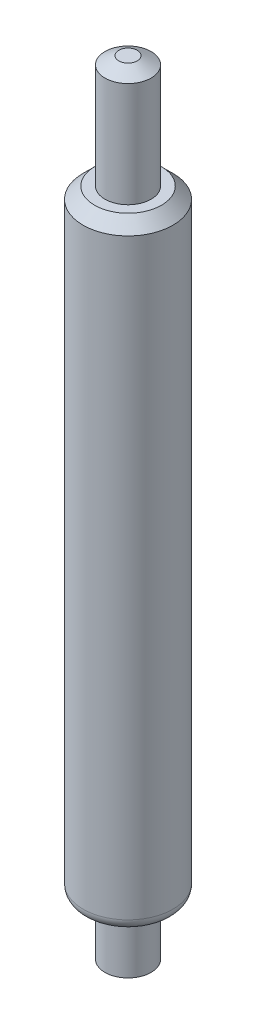
ISO-10303-21;
HEADER;
FILE_DESCRIPTION(('STEP AP214'),'2;1');
FILE_NAME('part.step','',(''),(''),'','','');
FILE_SCHEMA(('AUTOMOTIVE_DESIGN { 1 0 10303 214 1 1 1 1 }'));
ENDSEC;
DATA;
#1=APPLICATION_CONTEXT('core data for automotive mechanical design processes');
#2=APPLICATION_PROTOCOL_DEFINITION('international standard','automotive_design',2000,#1);
#3=PRODUCT_CONTEXT('',#1,'mechanical');
#4=PRODUCT('Part','Part','',(#3));
#5=PRODUCT_RELATED_PRODUCT_CATEGORY('part','',(#4));
#6=PRODUCT_DEFINITION_FORMATION('','',#4);
#7=PRODUCT_DEFINITION_CONTEXT('part definition',#1,'design');
#8=PRODUCT_DEFINITION('design','',#6,#7);
#9=PRODUCT_DEFINITION_SHAPE('','',#8);
#10=(LENGTH_UNIT() NAMED_UNIT(*) SI_UNIT(.MILLI.,.METRE.));
#11=(NAMED_UNIT(*) PLANE_ANGLE_UNIT() SI_UNIT($,.RADIAN.));
#12=(NAMED_UNIT(*) SI_UNIT($,.STERADIAN.) SOLID_ANGLE_UNIT());
#13=UNCERTAINTY_MEASURE_WITH_UNIT(LENGTH_MEASURE(1.E-05),#10,'distance_accuracy_value','');
#14=(GEOMETRIC_REPRESENTATION_CONTEXT(3) GLOBAL_UNCERTAINTY_ASSIGNED_CONTEXT((#13)) GLOBAL_UNIT_ASSIGNED_CONTEXT((#10,
#11,#12)) REPRESENTATION_CONTEXT('',''));
#15=CARTESIAN_POINT('',(0.,0.,0.));
#16=DIRECTION('',(0.,0.,1.));
#17=DIRECTION('',(1.,0.,0.));
#18=AXIS2_PLACEMENT_3D('',#15,#16,#17);
#19=CARTESIAN_POINT('',(0.,1.715,0.));
#20=DIRECTION('',(0.,1.,0.));
#21=DIRECTION('',(0.,0.,1.));
#22=AXIS2_PLACEMENT_3D('',#19,#20,#21);
#23=PLANE('',#22);
#24=CARTESIAN_POINT('',(0.,1.715,0.));
#25=DIRECTION('',(0.,1.,0.));
#26=DIRECTION('',(0.,0.,1.));
#27=AXIS2_PLACEMENT_3D('',#24,#25,#26);
#28=CIRCLE('',#27,0.0400000000000001);
#29=CARTESIAN_POINT('',(0.,1.715,0.0400000000000001));
#30=VERTEX_POINT('',#29);
#31=EDGE_CURVE('E75',#30,#30,#28,.T.);
#32=ORIENTED_EDGE('',*,*,#31,.T.);
#33=EDGE_LOOP('',(#32));
#34=FACE_BOUND('',#33,.T.);
#35=ADVANCED_FACE('F43',(#34),#23,.T.);
#36=CARTESIAN_POINT('',(0.,-1.05749908162705,0.));
#37=DIRECTION('',(0.,-1.,0.));
#38=DIRECTION('',(0.,0.,-1.));
#39=AXIS2_PLACEMENT_3D('',#36,#37,#38);
#40=CYLINDRICAL_SURFACE('',#39,0.1);
#41=CARTESIAN_POINT('',(0.,1.68035898384862,0.));
#42=DIRECTION('',(0.,1.,0.));
#43=DIRECTION('',(0.,0.,1.));
#44=AXIS2_PLACEMENT_3D('',#41,#42,#43);
#45=CIRCLE('',#44,0.1);
#46=CARTESIAN_POINT('',(0.,1.68035898384862,0.1));
#47=VERTEX_POINT('',#46);
#48=EDGE_CURVE('E79',#47,#47,#45,.F.);
#49=ORIENTED_EDGE('',*,*,#48,.T.);
#50=EDGE_LOOP('',(#49));
#51=FACE_BOUND('',#50,.T.);
#52=CARTESIAN_POINT('',(0.,1.225,0.));
#53=DIRECTION('',(0.,-1.,0.));
#54=DIRECTION('',(0.,0.,-1.));
#55=AXIS2_PLACEMENT_3D('',#52,#53,#54);
#56=CIRCLE('',#55,0.1);
#57=CARTESIAN_POINT('',(0.,1.225,-0.1));
#58=VERTEX_POINT('',#57);
#59=EDGE_CURVE('E83',#58,#58,#56,.T.);
#60=ORIENTED_EDGE('',*,*,#59,.F.);
#61=EDGE_LOOP('',(#60));
#62=FACE_BOUND('',#61,.T.);
#63=ADVANCED_FACE('F108',(#51,#62),#40,.T.);
#64=CARTESIAN_POINT('',(0.1,1.225,0.));
#65=DIRECTION('',(0.,1.,0.));
#66=DIRECTION('',(0.,0.,1.));
#67=AXIS2_PLACEMENT_3D('',#64,#65,#66);
#68=PLANE('',#67);
#69=CARTESIAN_POINT('',(0.,1.225,0.));
#70=DIRECTION('',(0.,1.,0.));
#71=DIRECTION('',(0.,0.,1.));
#72=AXIS2_PLACEMENT_3D('',#69,#70,#71);
#73=CIRCLE('',#72,0.145000000000001);
#74=CARTESIAN_POINT('',(0.,1.225,0.145000000000001));
#75=VERTEX_POINT('',#74);
#76=EDGE_CURVE('E56',#75,#75,#73,.T.);
#77=ORIENTED_EDGE('',*,*,#76,.T.);
#78=EDGE_LOOP('',(#77));
#79=FACE_BOUND('',#78,.T.);
#80=ORIENTED_EDGE('',*,*,#59,.T.);
#81=EDGE_LOOP('',(#80));
#82=FACE_BOUND('',#81,.T.);
#83=ADVANCED_FACE('F105',(#79,#82),#68,.T.);
#84=CARTESIAN_POINT('',(0.,-1.05749908162705,0.));
#85=DIRECTION('',(0.,-1.,0.));
#86=DIRECTION('',(0.,0.,-1.));
#87=AXIS2_PLACEMENT_3D('',#84,#85,#86);
#88=CYLINDRICAL_SURFACE('',#87,0.195);
#89=CARTESIAN_POINT('',(0.,-1.395,0.));
#90=DIRECTION('',(0.,-1.,0.));
#91=DIRECTION('',(0.,0.,-1.));
#92=AXIS2_PLACEMENT_3D('',#89,#90,#91);
#93=CIRCLE('',#92,0.195);
#94=CARTESIAN_POINT('',(0.,-1.395,-0.195));
#95=VERTEX_POINT('',#94);
#96=EDGE_CURVE('E10',#95,#95,#93,.F.);
#97=ORIENTED_EDGE('',*,*,#96,.T.);
#98=EDGE_LOOP('',(#97));
#99=FACE_BOUND('',#98,.T.);
#100=CARTESIAN_POINT('',(0.,1.175,0.));
#101=DIRECTION('',(0.,1.,0.));
#102=DIRECTION('',(0.,0.,1.));
#103=AXIS2_PLACEMENT_3D('',#100,#101,#102);
#104=CIRCLE('',#103,0.195);
#105=CARTESIAN_POINT('',(0.,1.175,0.195));
#106=VERTEX_POINT('',#105);
#107=EDGE_CURVE('E61',#106,#106,#104,.F.);
#108=ORIENTED_EDGE('',*,*,#107,.T.);
#109=EDGE_LOOP('',(#108));
#110=FACE_BOUND('',#109,.T.);
#111=ADVANCED_FACE('F96',(#99,#110),#88,.T.);
#112=CARTESIAN_POINT('',(0.195,-1.445,0.));
#113=DIRECTION('',(0.,-1.,0.));
#114=DIRECTION('',(0.,0.,-1.));
#115=AXIS2_PLACEMENT_3D('',#112,#113,#114);
#116=PLANE('',#115);
#117=CARTESIAN_POINT('',(0.,-1.445,0.));
#118=DIRECTION('',(0.,-1.,0.));
#119=DIRECTION('',(0.,0.,-1.));
#120=AXIS2_PLACEMENT_3D('',#117,#118,#119);
#121=CIRCLE('',#120,0.145);
#122=CARTESIAN_POINT('',(0.,-1.445,-0.145));
#123=VERTEX_POINT('',#122);
#124=EDGE_CURVE('E51',#123,#123,#121,.T.);
#125=ORIENTED_EDGE('',*,*,#124,.T.);
#126=EDGE_LOOP('',(#125));
#127=FACE_BOUND('',#126,.T.);
#128=CARTESIAN_POINT('',(0.,-1.445,0.));
#129=DIRECTION('',(0.,-1.,0.));
#130=DIRECTION('',(0.,0.,-1.));
#131=AXIS2_PLACEMENT_3D('',#128,#129,#130);
#132=CIRCLE('',#131,0.1);
#133=CARTESIAN_POINT('',(0.,-1.445,-0.1));
#134=VERTEX_POINT('',#133);
#135=EDGE_CURVE('E87',#134,#134,#132,.T.);
#136=ORIENTED_EDGE('',*,*,#135,.F.);
#137=EDGE_LOOP('',(#136));
#138=FACE_BOUND('',#137,.T.);
#139=ADVANCED_FACE('F94',(#127,#138),#116,.T.);
#140=CARTESIAN_POINT('',(0.,-1.05749908162705,0.));
#141=DIRECTION('',(0.,-1.,0.));
#142=DIRECTION('',(0.,0.,-1.));
#143=AXIS2_PLACEMENT_3D('',#140,#141,#142);
#144=CYLINDRICAL_SURFACE('',#143,0.1);
#145=CARTESIAN_POINT('',(0.,-1.68035898384862,0.));
#146=DIRECTION('',(0.,-1.,0.));
#147=DIRECTION('',(0.,0.,-1.));
#148=AXIS2_PLACEMENT_3D('',#145,#146,#147);
#149=CIRCLE('',#148,0.1);
#150=CARTESIAN_POINT('',(0.,-1.68035898384862,-0.1));
#151=VERTEX_POINT('',#150);
#152=EDGE_CURVE('E67',#151,#151,#149,.F.);
#153=ORIENTED_EDGE('',*,*,#152,.T.);
#154=EDGE_LOOP('',(#153));
#155=FACE_BOUND('',#154,.T.);
#156=ORIENTED_EDGE('',*,*,#135,.T.);
#157=EDGE_LOOP('',(#156));
#158=FACE_BOUND('',#157,.T.);
#159=ADVANCED_FACE('F92',(#155,#158),#144,.T.);
#160=CARTESIAN_POINT('',(0.1,-1.715,0.));
#161=DIRECTION('',(0.,-1.,0.));
#162=DIRECTION('',(0.,0.,-1.));
#163=AXIS2_PLACEMENT_3D('',#160,#161,#162);
#164=PLANE('',#163);
#165=CARTESIAN_POINT('',(0.,-1.715,0.));
#166=DIRECTION('',(0.,-1.,0.));
#167=DIRECTION('',(0.,0.,-1.));
#168=AXIS2_PLACEMENT_3D('',#165,#166,#167);
#169=CIRCLE('',#168,0.0400000000000005);
#170=CARTESIAN_POINT('',(0.,-1.715,-0.0400000000000005));
#171=VERTEX_POINT('',#170);
#172=EDGE_CURVE('E71',#171,#171,#169,.T.);
#173=ORIENTED_EDGE('',*,*,#172,.T.);
#174=EDGE_LOOP('',(#173));
#175=FACE_BOUND('',#174,.T.);
#176=ADVANCED_FACE('F102',(#175),#164,.T.);
#177=CARTESIAN_POINT('',(0.,1.68035898384862,0.));
#178=DIRECTION('',(0.,-1.,0.));
#179=DIRECTION('',(0.,0.,-1.));
#180=AXIS2_PLACEMENT_3D('',#177,#178,#179);
#181=CONICAL_SURFACE('',#180,0.1,1.0471975511966);
#182=ORIENTED_EDGE('',*,*,#31,.F.);
#183=EDGE_LOOP('',(#182));
#184=FACE_BOUND('',#183,.T.);
#185=ORIENTED_EDGE('',*,*,#48,.F.);
#186=EDGE_LOOP('',(#185));
#187=FACE_BOUND('',#186,.T.);
#188=ADVANCED_FACE('F119',(#184,#187),#181,.T.);
#189=CARTESIAN_POINT('',(0.,-1.715,0.));
#190=DIRECTION('',(0.,1.,0.));
#191=DIRECTION('',(0.,0.,1.));
#192=AXIS2_PLACEMENT_3D('',#189,#190,#191);
#193=CONICAL_SURFACE('',#192,0.0400000000000005,1.0471975511966);
#194=ORIENTED_EDGE('',*,*,#152,.F.);
#195=EDGE_LOOP('',(#194));
#196=FACE_BOUND('',#195,.T.);
#197=ORIENTED_EDGE('',*,*,#172,.F.);
#198=EDGE_LOOP('',(#197));
#199=FACE_BOUND('',#198,.T.);
#200=ADVANCED_FACE('F125',(#196,#199),#193,.T.);
#201=CARTESIAN_POINT('',(0.,1.175,0.));
#202=DIRECTION('',(0.,-1.,0.));
#203=DIRECTION('',(0.,0.,-1.));
#204=AXIS2_PLACEMENT_3D('',#201,#202,#203);
#205=CONICAL_SURFACE('',#204,0.195,0.785398163397456);
#206=ORIENTED_EDGE('',*,*,#76,.F.);
#207=EDGE_LOOP('',(#206));
#208=FACE_BOUND('',#207,.T.);
#209=ORIENTED_EDGE('',*,*,#107,.F.);
#210=EDGE_LOOP('',(#209));
#211=FACE_BOUND('',#210,.T.);
#212=ADVANCED_FACE('F131',(#208,#211),#205,.T.);
#213=CARTESIAN_POINT('',(0.,-1.395,0.));
#214=DIRECTION('',(0.,-1.,0.));
#215=DIRECTION('',(0.,0.,-1.));
#216=AXIS2_PLACEMENT_3D('',#213,#214,#215);
#217=TOROIDAL_SURFACE('',#216,0.145,0.05);
#218=ORIENTED_EDGE('',*,*,#96,.F.);
#219=EDGE_LOOP('',(#218));
#220=FACE_BOUND('',#219,.T.);
#221=ORIENTED_EDGE('',*,*,#124,.F.);
#222=EDGE_LOOP('',(#221));
#223=FACE_BOUND('',#222,.T.);
#224=ADVANCED_FACE('F45',(#220,#223),#217,.T.);
#225=CLOSED_SHELL('',(#35,#63,#83,#111,#139,#159,#176,#188,#200,#212,#224));
#226=MANIFOLD_SOLID_BREP('B2',#225);
#227=ADVANCED_BREP_SHAPE_REPRESENTATION('',(#18,#226),#14);
#228=SHAPE_DEFINITION_REPRESENTATION(#9,#227);
ENDSEC;
END-ISO-10303-21;
